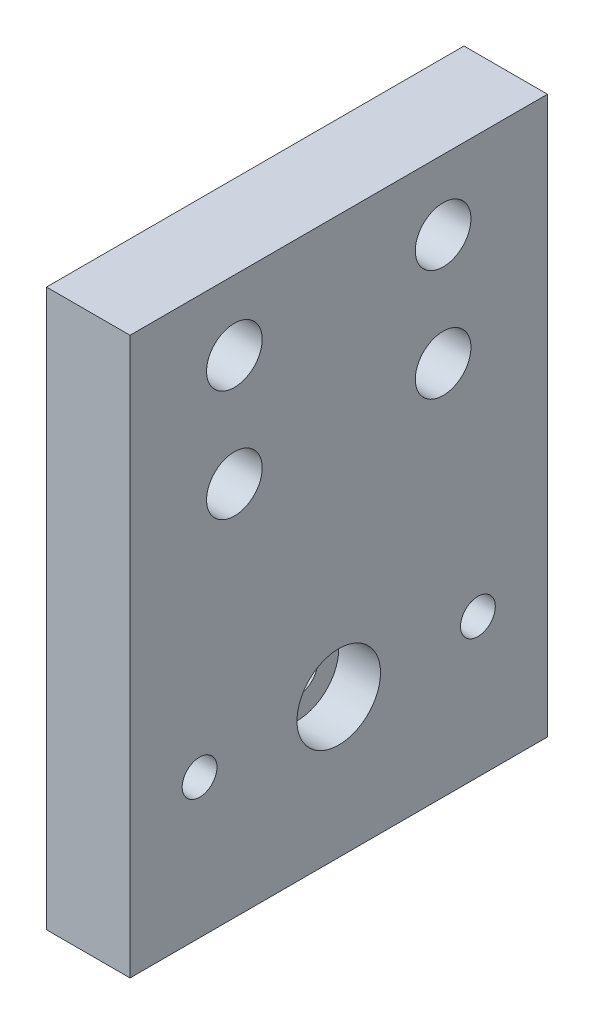
ISO-10303-21;
HEADER;
FILE_DESCRIPTION(('STEP AP214'),'2;1');
FILE_NAME('part.step','',(''),(''),'','','');
FILE_SCHEMA(('AUTOMOTIVE_DESIGN { 1 0 10303 214 1 1 1 1 }'));
ENDSEC;
DATA;
#1=APPLICATION_CONTEXT('core data for automotive mechanical design processes');
#2=APPLICATION_PROTOCOL_DEFINITION('international standard','automotive_design',2000,#1);
#3=PRODUCT_CONTEXT('',#1,'mechanical');
#4=PRODUCT('Part','Part','',(#3));
#5=PRODUCT_RELATED_PRODUCT_CATEGORY('part','',(#4));
#6=PRODUCT_DEFINITION_FORMATION('','',#4);
#7=PRODUCT_DEFINITION_CONTEXT('part definition',#1,'design');
#8=PRODUCT_DEFINITION('design','',#6,#7);
#9=PRODUCT_DEFINITION_SHAPE('','',#8);
#10=(LENGTH_UNIT() NAMED_UNIT(*) SI_UNIT(.MILLI.,.METRE.));
#11=(NAMED_UNIT(*) PLANE_ANGLE_UNIT() SI_UNIT($,.RADIAN.));
#12=(NAMED_UNIT(*) SI_UNIT($,.STERADIAN.) SOLID_ANGLE_UNIT());
#13=UNCERTAINTY_MEASURE_WITH_UNIT(LENGTH_MEASURE(1.E-05),#10,'distance_accuracy_value','');
#14=(GEOMETRIC_REPRESENTATION_CONTEXT(3) GLOBAL_UNCERTAINTY_ASSIGNED_CONTEXT((#13)) GLOBAL_UNIT_ASSIGNED_CONTEXT((#10,
#11,#12)) REPRESENTATION_CONTEXT('',''));
#15=CARTESIAN_POINT('',(0.,0.,0.));
#16=DIRECTION('',(0.,0.,1.));
#17=DIRECTION('',(1.,0.,0.));
#18=AXIS2_PLACEMENT_3D('',#15,#16,#17);
#19=CARTESIAN_POINT('',(0.,50.,25.));
#20=DIRECTION('',(1.,0.,0.));
#21=DIRECTION('',(0.,0.,-1.));
#22=AXIS2_PLACEMENT_3D('',#19,#20,#21);
#23=CYLINDRICAL_SURFACE('',#22,4.50000000000001);
#24=CARTESIAN_POINT('',(0.,50.,25.));
#25=DIRECTION('',(1.,0.,0.));
#26=DIRECTION('',(0.,0.,-1.));
#27=AXIS2_PLACEMENT_3D('',#24,#25,#26);
#28=CIRCLE('',#27,4.50000000000001);
#29=CARTESIAN_POINT('',(0.,50.,20.5));
#30=VERTEX_POINT('',#29);
#31=EDGE_CURVE('E114',#30,#30,#28,.T.);
#32=ORIENTED_EDGE('',*,*,#31,.F.);
#33=EDGE_LOOP('',(#32));
#34=FACE_BOUND('',#33,.T.);
#35=CARTESIAN_POINT('',(21.,50.,25.));
#36=DIRECTION('',(1.,0.,0.));
#37=DIRECTION('',(0.,0.,-1.));
#38=AXIS2_PLACEMENT_3D('',#35,#36,#37);
#39=CIRCLE('',#38,4.50000000000001);
#40=CARTESIAN_POINT('',(21.,50.,20.5));
#41=VERTEX_POINT('',#40);
#42=EDGE_CURVE('E36',#41,#41,#39,.F.);
#43=ORIENTED_EDGE('',*,*,#42,.F.);
#44=EDGE_LOOP('',(#43));
#45=FACE_BOUND('',#44,.T.);
#46=ADVANCED_FACE('F32',(#34,#45),#23,.F.);
#47=CARTESIAN_POINT('',(0.,50.,125.));
#48=DIRECTION('',(1.,0.,0.));
#49=DIRECTION('',(0.,0.,-1.));
#50=AXIS2_PLACEMENT_3D('',#47,#48,#49);
#51=CYLINDRICAL_SURFACE('',#50,4.49999999999999);
#52=CARTESIAN_POINT('',(0.,50.,125.));
#53=DIRECTION('',(1.,0.,0.));
#54=DIRECTION('',(0.,0.,-1.));
#55=AXIS2_PLACEMENT_3D('',#52,#53,#54);
#56=CIRCLE('',#55,4.49999999999999);
#57=CARTESIAN_POINT('',(0.,50.,120.5));
#58=VERTEX_POINT('',#57);
#59=EDGE_CURVE('E119',#58,#58,#56,.T.);
#60=ORIENTED_EDGE('',*,*,#59,.F.);
#61=EDGE_LOOP('',(#60));
#62=FACE_BOUND('',#61,.T.);
#63=CARTESIAN_POINT('',(21.,50.,125.));
#64=DIRECTION('',(1.,0.,0.));
#65=DIRECTION('',(0.,0.,-1.));
#66=AXIS2_PLACEMENT_3D('',#63,#64,#65);
#67=CIRCLE('',#66,4.49999999999999);
#68=CARTESIAN_POINT('',(21.,50.,120.5));
#69=VERTEX_POINT('',#68);
#70=EDGE_CURVE('E112',#69,#69,#67,.F.);
#71=ORIENTED_EDGE('',*,*,#70,.F.);
#72=EDGE_LOOP('',(#71));
#73=FACE_BOUND('',#72,.T.);
#74=ADVANCED_FACE('F185',(#62,#73),#51,.F.);
#75=CARTESIAN_POINT('',(30.,0.,0.));
#76=DIRECTION('',(0.,0.,1.));
#77=DIRECTION('',(1.,0.,0.));
#78=AXIS2_PLACEMENT_3D('',#75,#76,#77);
#79=PLANE('',#78);
#80=DIRECTION('',(0.,1.,0.));
#81=VECTOR('',#80,1.);
#82=CARTESIAN_POINT('',(0.,0.,0.));
#83=LINE('',#82,#81);
#84=CARTESIAN_POINT('',(0.,0.,0.));
#85=VERTEX_POINT('',#84);
#86=CARTESIAN_POINT('',(0.,200.,0.));
#87=VERTEX_POINT('',#86);
#88=EDGE_CURVE('E99',#85,#87,#83,.T.);
#89=ORIENTED_EDGE('',*,*,#88,.T.);
#90=DIRECTION('',(-1.,0.,0.));
#91=VECTOR('',#90,1.);
#92=CARTESIAN_POINT('',(30.,200.,0.));
#93=LINE('',#92,#91);
#94=CARTESIAN_POINT('',(30.,200.,0.));
#95=VERTEX_POINT('',#94);
#96=EDGE_CURVE('E11',#95,#87,#93,.T.);
#97=ORIENTED_EDGE('',*,*,#96,.F.);
#98=DIRECTION('',(0.,1.,0.));
#99=VECTOR('',#98,1.);
#100=CARTESIAN_POINT('',(30.,0.,0.));
#101=LINE('',#100,#99);
#102=CARTESIAN_POINT('',(30.,0.,0.));
#103=VERTEX_POINT('',#102);
#104=EDGE_CURVE('E86',#103,#95,#101,.T.);
#105=ORIENTED_EDGE('',*,*,#104,.F.);
#106=DIRECTION('',(-1.,0.,0.));
#107=VECTOR('',#106,1.);
#108=CARTESIAN_POINT('',(30.,0.,0.));
#109=LINE('',#108,#107);
#110=EDGE_CURVE('E95',#103,#85,#109,.T.);
#111=ORIENTED_EDGE('',*,*,#110,.T.);
#112=EDGE_LOOP('',(#89,#97,#105,#111));
#113=FACE_BOUND('',#112,.T.);
#114=ADVANCED_FACE('F34',(#113),#79,.F.);
#115=CARTESIAN_POINT('',(30.,200.,0.));
#116=DIRECTION('',(0.,-1.,0.));
#117=DIRECTION('',(0.,0.,-1.));
#118=AXIS2_PLACEMENT_3D('',#115,#116,#117);
#119=PLANE('',#118);
#120=DIRECTION('',(0.,0.,1.));
#121=VECTOR('',#120,1.);
#122=CARTESIAN_POINT('',(0.,200.,0.));
#123=LINE('',#122,#121);
#124=CARTESIAN_POINT('',(0.,200.,150.));
#125=VERTEX_POINT('',#124);
#126=EDGE_CURVE('E90',#87,#125,#123,.T.);
#127=ORIENTED_EDGE('',*,*,#126,.T.);
#128=DIRECTION('',(-1.,0.,0.));
#129=VECTOR('',#128,1.);
#130=CARTESIAN_POINT('',(30.,200.,150.));
#131=LINE('',#130,#129);
#132=CARTESIAN_POINT('',(30.,200.,150.));
#133=VERTEX_POINT('',#132);
#134=EDGE_CURVE('E42',#133,#125,#131,.T.);
#135=ORIENTED_EDGE('',*,*,#134,.F.);
#136=DIRECTION('',(0.,0.,1.));
#137=VECTOR('',#136,1.);
#138=CARTESIAN_POINT('',(30.,200.,0.));
#139=LINE('',#138,#137);
#140=EDGE_CURVE('E81',#95,#133,#139,.T.);
#141=ORIENTED_EDGE('',*,*,#140,.F.);
#142=ORIENTED_EDGE('',*,*,#96,.T.);
#143=EDGE_LOOP('',(#127,#135,#141,#142));
#144=FACE_BOUND('',#143,.T.);
#145=ADVANCED_FACE('F89',(#144),#119,.F.);
#146=CARTESIAN_POINT('',(30.,0.,150.));
#147=DIRECTION('',(0.,0.,-1.));
#148=DIRECTION('',(-1.,0.,0.));
#149=AXIS2_PLACEMENT_3D('',#146,#147,#148);
#150=PLANE('',#149);
#151=DIRECTION('',(0.,-1.,0.));
#152=VECTOR('',#151,1.);
#153=CARTESIAN_POINT('',(0.,0.,150.));
#154=LINE('',#153,#152);
#155=CARTESIAN_POINT('',(0.,0.,150.));
#156=VERTEX_POINT('',#155);
#157=EDGE_CURVE('E68',#125,#156,#154,.T.);
#158=ORIENTED_EDGE('',*,*,#157,.T.);
#159=DIRECTION('',(-1.,0.,0.));
#160=VECTOR('',#159,1.);
#161=CARTESIAN_POINT('',(30.,0.,150.));
#162=LINE('',#161,#160);
#163=CARTESIAN_POINT('',(30.,0.,150.));
#164=VERTEX_POINT('',#163);
#165=EDGE_CURVE('E91',#164,#156,#162,.T.);
#166=ORIENTED_EDGE('',*,*,#165,.F.);
#167=DIRECTION('',(0.,-1.,0.));
#168=VECTOR('',#167,1.);
#169=CARTESIAN_POINT('',(30.,0.,150.));
#170=LINE('',#169,#168);
#171=EDGE_CURVE('E84',#133,#164,#170,.T.);
#172=ORIENTED_EDGE('',*,*,#171,.F.);
#173=ORIENTED_EDGE('',*,*,#134,.T.);
#174=EDGE_LOOP('',(#158,#166,#172,#173));
#175=FACE_BOUND('',#174,.T.);
#176=ADVANCED_FACE('F93',(#175),#150,.F.);
#177=CARTESIAN_POINT('',(30.,0.,0.));
#178=DIRECTION('',(0.,1.,0.));
#179=DIRECTION('',(0.,0.,1.));
#180=AXIS2_PLACEMENT_3D('',#177,#178,#179);
#181=PLANE('',#180);
#182=DIRECTION('',(0.,0.,-1.));
#183=VECTOR('',#182,1.);
#184=CARTESIAN_POINT('',(0.,0.,0.));
#185=LINE('',#184,#183);
#186=EDGE_CURVE('E74',#156,#85,#185,.T.);
#187=ORIENTED_EDGE('',*,*,#186,.T.);
#188=ORIENTED_EDGE('',*,*,#110,.F.);
#189=DIRECTION('',(0.,0.,-1.));
#190=VECTOR('',#189,1.);
#191=CARTESIAN_POINT('',(30.,0.,0.));
#192=LINE('',#191,#190);
#193=EDGE_CURVE('E51',#164,#103,#192,.T.);
#194=ORIENTED_EDGE('',*,*,#193,.F.);
#195=ORIENTED_EDGE('',*,*,#165,.T.);
#196=EDGE_LOOP('',(#187,#188,#194,#195));
#197=FACE_BOUND('',#196,.T.);
#198=ADVANCED_FACE('F169',(#197),#181,.F.);
#199=CARTESIAN_POINT('',(30.,0.,0.));
#200=DIRECTION('',(1.,0.,0.));
#201=DIRECTION('',(0.,0.,-1.));
#202=AXIS2_PLACEMENT_3D('',#199,#200,#201);
#203=PLANE('',#202);
#204=CARTESIAN_POINT('',(30.,50.,25.));
#205=DIRECTION('',(1.,0.,0.));
#206=DIRECTION('',(0.,0.,-1.));
#207=AXIS2_PLACEMENT_3D('',#204,#205,#206);
#208=CIRCLE('',#207,6.25);
#209=CARTESIAN_POINT('',(30.,50.,18.75));
#210=VERTEX_POINT('',#209);
#211=EDGE_CURVE('E129',#210,#210,#208,.T.);
#212=ORIENTED_EDGE('',*,*,#211,.F.);
#213=EDGE_LOOP('',(#212));
#214=FACE_BOUND('',#213,.T.);
#215=CARTESIAN_POINT('',(30.,50.,125.));
#216=DIRECTION('',(1.,0.,0.));
#217=DIRECTION('',(0.,0.,-1.));
#218=AXIS2_PLACEMENT_3D('',#215,#216,#217);
#219=CIRCLE('',#218,6.25);
#220=CARTESIAN_POINT('',(30.,50.,118.75));
#221=VERTEX_POINT('',#220);
#222=EDGE_CURVE('E122',#221,#221,#219,.T.);
#223=ORIENTED_EDGE('',*,*,#222,.F.);
#224=EDGE_LOOP('',(#223));
#225=FACE_BOUND('',#224,.T.);
#226=CARTESIAN_POINT('',(30.,50.,75.));
#227=DIRECTION('',(1.,0.,0.));
#228=DIRECTION('',(0.,0.,-1.));
#229=AXIS2_PLACEMENT_3D('',#226,#227,#228);
#230=CIRCLE('',#229,15.);
#231=CARTESIAN_POINT('',(30.,50.,60.));
#232=VERTEX_POINT('',#231);
#233=EDGE_CURVE('E110',#232,#232,#230,.T.);
#234=ORIENTED_EDGE('',*,*,#233,.F.);
#235=EDGE_LOOP('',(#234));
#236=FACE_BOUND('',#235,.T.);
#237=CARTESIAN_POINT('',(30.,175.,37.5000000000001));
#238=DIRECTION('',(1.,0.,0.));
#239=DIRECTION('',(0.,0.,1.));
#240=AXIS2_PLACEMENT_3D('',#237,#238,#239);
#241=CIRCLE('',#240,10.);
#242=CARTESIAN_POINT('',(30.,175.,47.5000000000001));
#243=VERTEX_POINT('',#242);
#244=EDGE_CURVE('E146',#243,#243,#241,.T.);
#245=ORIENTED_EDGE('',*,*,#244,.F.);
#246=EDGE_LOOP('',(#245));
#247=FACE_BOUND('',#246,.T.);
#248=CARTESIAN_POINT('',(30.,135.,112.5));
#249=DIRECTION('',(1.,0.,0.));
#250=DIRECTION('',(0.,0.,-1.));
#251=AXIS2_PLACEMENT_3D('',#248,#249,#250);
#252=CIRCLE('',#251,10.);
#253=CARTESIAN_POINT('',(30.,135.,102.5));
#254=VERTEX_POINT('',#253);
#255=EDGE_CURVE('E152',#254,#254,#252,.T.);
#256=ORIENTED_EDGE('',*,*,#255,.F.);
#257=EDGE_LOOP('',(#256));
#258=FACE_BOUND('',#257,.T.);
#259=CARTESIAN_POINT('',(30.,135.,37.5));
#260=DIRECTION('',(1.,0.,0.));
#261=DIRECTION('',(0.,0.,1.));
#262=AXIS2_PLACEMENT_3D('',#259,#260,#261);
#263=CIRCLE('',#262,10.);
#264=CARTESIAN_POINT('',(30.,135.,47.5));
#265=VERTEX_POINT('',#264);
#266=EDGE_CURVE('E139',#265,#265,#263,.T.);
#267=ORIENTED_EDGE('',*,*,#266,.F.);
#268=EDGE_LOOP('',(#267));
#269=FACE_BOUND('',#268,.T.);
#270=CARTESIAN_POINT('',(30.,175.,112.5));
#271=DIRECTION('',(1.,0.,0.));
#272=DIRECTION('',(0.,0.,-1.));
#273=AXIS2_PLACEMENT_3D('',#270,#271,#272);
#274=CIRCLE('',#273,10.);
#275=CARTESIAN_POINT('',(30.,175.,102.5));
#276=VERTEX_POINT('',#275);
#277=EDGE_CURVE('E145',#276,#276,#274,.T.);
#278=ORIENTED_EDGE('',*,*,#277,.F.);
#279=EDGE_LOOP('',(#278));
#280=FACE_BOUND('',#279,.T.);
#281=ORIENTED_EDGE('',*,*,#104,.T.);
#282=ORIENTED_EDGE('',*,*,#140,.T.);
#283=ORIENTED_EDGE('',*,*,#171,.T.);
#284=ORIENTED_EDGE('',*,*,#193,.T.);
#285=EDGE_LOOP('',(#281,#282,#283,#284));
#286=FACE_BOUND('',#285,.T.);
#287=ADVANCED_FACE('F82',(#214,#225,#236,#247,#258,#269,#280,#286),#203,.T.);
#288=CARTESIAN_POINT('',(0.,0.,0.));
#289=DIRECTION('',(1.,0.,0.));
#290=DIRECTION('',(0.,0.,-1.));
#291=AXIS2_PLACEMENT_3D('',#288,#289,#290);
#292=PLANE('',#291);
#293=ORIENTED_EDGE('',*,*,#31,.T.);
#294=EDGE_LOOP('',(#293));
#295=FACE_BOUND('',#294,.T.);
#296=ORIENTED_EDGE('',*,*,#59,.T.);
#297=EDGE_LOOP('',(#296));
#298=FACE_BOUND('',#297,.T.);
#299=CARTESIAN_POINT('',(0.,50.,75.));
#300=DIRECTION('',(1.,0.,0.));
#301=DIRECTION('',(0.,0.,-1.));
#302=AXIS2_PLACEMENT_3D('',#299,#300,#301);
#303=CIRCLE('',#302,7.5);
#304=CARTESIAN_POINT('',(0.,50.,67.5));
#305=VERTEX_POINT('',#304);
#306=EDGE_CURVE('E111',#305,#305,#303,.T.);
#307=ORIENTED_EDGE('',*,*,#306,.T.);
#308=EDGE_LOOP('',(#307));
#309=FACE_BOUND('',#308,.T.);
#310=CARTESIAN_POINT('',(0.,175.,37.5000000000001));
#311=DIRECTION('',(1.,0.,0.));
#312=DIRECTION('',(0.,0.,1.));
#313=AXIS2_PLACEMENT_3D('',#310,#311,#312);
#314=CIRCLE('',#313,10.);
#315=CARTESIAN_POINT('',(0.,175.,47.5000000000001));
#316=VERTEX_POINT('',#315);
#317=EDGE_CURVE('E142',#316,#316,#314,.T.);
#318=ORIENTED_EDGE('',*,*,#317,.T.);
#319=EDGE_LOOP('',(#318));
#320=FACE_BOUND('',#319,.T.);
#321=CARTESIAN_POINT('',(0.,135.,112.5));
#322=DIRECTION('',(1.,0.,0.));
#323=DIRECTION('',(0.,0.,-1.));
#324=AXIS2_PLACEMENT_3D('',#321,#322,#323);
#325=CIRCLE('',#324,10.);
#326=CARTESIAN_POINT('',(0.,135.,102.5));
#327=VERTEX_POINT('',#326);
#328=EDGE_CURVE('E149',#327,#327,#325,.T.);
#329=ORIENTED_EDGE('',*,*,#328,.T.);
#330=EDGE_LOOP('',(#329));
#331=FACE_BOUND('',#330,.T.);
#332=CARTESIAN_POINT('',(0.,135.,37.5));
#333=DIRECTION('',(1.,0.,0.));
#334=DIRECTION('',(0.,0.,1.));
#335=AXIS2_PLACEMENT_3D('',#332,#333,#334);
#336=CIRCLE('',#335,10.);
#337=CARTESIAN_POINT('',(0.,135.,47.5));
#338=VERTEX_POINT('',#337);
#339=EDGE_CURVE('E155',#338,#338,#336,.T.);
#340=ORIENTED_EDGE('',*,*,#339,.T.);
#341=EDGE_LOOP('',(#340));
#342=FACE_BOUND('',#341,.T.);
#343=CARTESIAN_POINT('',(0.,175.,112.5));
#344=DIRECTION('',(1.,0.,0.));
#345=DIRECTION('',(0.,0.,-1.));
#346=AXIS2_PLACEMENT_3D('',#343,#344,#345);
#347=CIRCLE('',#346,10.);
#348=CARTESIAN_POINT('',(0.,175.,102.5));
#349=VERTEX_POINT('',#348);
#350=EDGE_CURVE('E102',#349,#349,#347,.T.);
#351=ORIENTED_EDGE('',*,*,#350,.T.);
#352=EDGE_LOOP('',(#351));
#353=FACE_BOUND('',#352,.T.);
#354=ORIENTED_EDGE('',*,*,#88,.F.);
#355=ORIENTED_EDGE('',*,*,#186,.F.);
#356=ORIENTED_EDGE('',*,*,#157,.F.);
#357=ORIENTED_EDGE('',*,*,#126,.F.);
#358=EDGE_LOOP('',(#354,#355,#356,#357));
#359=FACE_BOUND('',#358,.T.);
#360=ADVANCED_FACE('F168',(#295,#298,#309,#320,#331,#342,#353,#359),#292,.F.);
#361=CARTESIAN_POINT('',(0.,175.,112.5));
#362=DIRECTION('',(1.,0.,0.));
#363=DIRECTION('',(0.,0.,-1.));
#364=AXIS2_PLACEMENT_3D('',#361,#362,#363);
#365=CYLINDRICAL_SURFACE('',#364,10.);
#366=ORIENTED_EDGE('',*,*,#350,.F.);
#367=EDGE_LOOP('',(#366));
#368=FACE_BOUND('',#367,.T.);
#369=ORIENTED_EDGE('',*,*,#277,.T.);
#370=EDGE_LOOP('',(#369));
#371=FACE_BOUND('',#370,.T.);
#372=ADVANCED_FACE('F165',(#368,#371),#365,.F.);
#373=CARTESIAN_POINT('',(0.,135.,37.5));
#374=DIRECTION('',(1.,0.,0.));
#375=DIRECTION('',(0.,0.,-1.));
#376=AXIS2_PLACEMENT_3D('',#373,#374,#375);
#377=CYLINDRICAL_SURFACE('',#376,10.);
#378=ORIENTED_EDGE('',*,*,#339,.F.);
#379=EDGE_LOOP('',(#378));
#380=FACE_BOUND('',#379,.T.);
#381=ORIENTED_EDGE('',*,*,#266,.T.);
#382=EDGE_LOOP('',(#381));
#383=FACE_BOUND('',#382,.T.);
#384=ADVANCED_FACE('F219',(#380,#383),#377,.F.);
#385=CARTESIAN_POINT('',(0.,135.,112.5));
#386=DIRECTION('',(1.,0.,0.));
#387=DIRECTION('',(0.,0.,-1.));
#388=AXIS2_PLACEMENT_3D('',#385,#386,#387);
#389=CYLINDRICAL_SURFACE('',#388,10.);
#390=ORIENTED_EDGE('',*,*,#328,.F.);
#391=EDGE_LOOP('',(#390));
#392=FACE_BOUND('',#391,.T.);
#393=ORIENTED_EDGE('',*,*,#255,.T.);
#394=EDGE_LOOP('',(#393));
#395=FACE_BOUND('',#394,.T.);
#396=ADVANCED_FACE('F215',(#392,#395),#389,.F.);
#397=CARTESIAN_POINT('',(0.,175.,37.5000000000001));
#398=DIRECTION('',(1.,0.,0.));
#399=DIRECTION('',(0.,0.,-1.));
#400=AXIS2_PLACEMENT_3D('',#397,#398,#399);
#401=CYLINDRICAL_SURFACE('',#400,10.);
#402=ORIENTED_EDGE('',*,*,#317,.F.);
#403=EDGE_LOOP('',(#402));
#404=FACE_BOUND('',#403,.T.);
#405=ORIENTED_EDGE('',*,*,#244,.T.);
#406=EDGE_LOOP('',(#405));
#407=FACE_BOUND('',#406,.T.);
#408=ADVANCED_FACE('F211',(#404,#407),#401,.F.);
#409=CARTESIAN_POINT('',(15.,50.,75.));
#410=DIRECTION('',(1.,0.,0.));
#411=DIRECTION('',(0.,0.,-1.));
#412=AXIS2_PLACEMENT_3D('',#409,#410,#411);
#413=CYLINDRICAL_SURFACE('',#412,15.);
#414=CARTESIAN_POINT('',(15.,50.,75.));
#415=DIRECTION('',(1.,0.,0.));
#416=DIRECTION('',(0.,0.,-1.));
#417=AXIS2_PLACEMENT_3D('',#414,#415,#416);
#418=CIRCLE('',#417,15.);
#419=CARTESIAN_POINT('',(15.,50.,60.));
#420=VERTEX_POINT('',#419);
#421=EDGE_CURVE('E136',#420,#420,#418,.T.);
#422=ORIENTED_EDGE('',*,*,#421,.F.);
#423=EDGE_LOOP('',(#422));
#424=FACE_BOUND('',#423,.T.);
#425=ORIENTED_EDGE('',*,*,#233,.T.);
#426=EDGE_LOOP('',(#425));
#427=FACE_BOUND('',#426,.T.);
#428=ADVANCED_FACE('F207',(#424,#427),#413,.F.);
#429=CARTESIAN_POINT('',(15.,50.,75.));
#430=DIRECTION('',(1.,0.,0.));
#431=DIRECTION('',(0.,0.,-1.));
#432=AXIS2_PLACEMENT_3D('',#429,#430,#431);
#433=PLANE('',#432);
#434=CARTESIAN_POINT('',(15.,50.,75.));
#435=DIRECTION('',(1.,0.,0.));
#436=DIRECTION('',(0.,0.,-1.));
#437=AXIS2_PLACEMENT_3D('',#434,#435,#436);
#438=CIRCLE('',#437,7.5);
#439=CARTESIAN_POINT('',(15.,50.,67.5));
#440=VERTEX_POINT('',#439);
#441=EDGE_CURVE('E108',#440,#440,#438,.T.);
#442=ORIENTED_EDGE('',*,*,#441,.F.);
#443=EDGE_LOOP('',(#442));
#444=FACE_BOUND('',#443,.T.);
#445=ORIENTED_EDGE('',*,*,#421,.T.);
#446=EDGE_LOOP('',(#445));
#447=FACE_BOUND('',#446,.T.);
#448=ADVANCED_FACE('F203',(#444,#447),#433,.T.);
#449=CARTESIAN_POINT('',(0.,50.,75.));
#450=DIRECTION('',(1.,0.,0.));
#451=DIRECTION('',(0.,0.,-1.));
#452=AXIS2_PLACEMENT_3D('',#449,#450,#451);
#453=CYLINDRICAL_SURFACE('',#452,7.5);
#454=ORIENTED_EDGE('',*,*,#441,.T.);
#455=EDGE_LOOP('',(#454));
#456=FACE_BOUND('',#455,.T.);
#457=ORIENTED_EDGE('',*,*,#306,.F.);
#458=EDGE_LOOP('',(#457));
#459=FACE_BOUND('',#458,.T.);
#460=ADVANCED_FACE('F200',(#456,#459),#453,.F.);
#461=CARTESIAN_POINT('',(21.,50.,125.));
#462=DIRECTION('',(1.,0.,0.));
#463=DIRECTION('',(0.,0.,-1.));
#464=AXIS2_PLACEMENT_3D('',#461,#462,#463);
#465=PLANE('',#464);
#466=CARTESIAN_POINT('',(21.,50.,125.));
#467=DIRECTION('',(1.,0.,0.));
#468=DIRECTION('',(0.,0.,-1.));
#469=AXIS2_PLACEMENT_3D('',#466,#467,#468);
#470=CIRCLE('',#469,6.25);
#471=CARTESIAN_POINT('',(21.,50.,118.75));
#472=VERTEX_POINT('',#471);
#473=EDGE_CURVE('E115',#472,#472,#470,.T.);
#474=ORIENTED_EDGE('',*,*,#473,.T.);
#475=EDGE_LOOP('',(#474));
#476=FACE_BOUND('',#475,.T.);
#477=ORIENTED_EDGE('',*,*,#70,.T.);
#478=EDGE_LOOP('',(#477));
#479=FACE_BOUND('',#478,.T.);
#480=ADVANCED_FACE('F202',(#476,#479),#465,.T.);
#481=CARTESIAN_POINT('',(21.,50.,125.));
#482=DIRECTION('',(1.,0.,0.));
#483=DIRECTION('',(0.,0.,-1.));
#484=AXIS2_PLACEMENT_3D('',#481,#482,#483);
#485=CYLINDRICAL_SURFACE('',#484,6.25);
#486=ORIENTED_EDGE('',*,*,#473,.F.);
#487=EDGE_LOOP('',(#486));
#488=FACE_BOUND('',#487,.T.);
#489=ORIENTED_EDGE('',*,*,#222,.T.);
#490=EDGE_LOOP('',(#489));
#491=FACE_BOUND('',#490,.T.);
#492=ADVANCED_FACE('F197',(#488,#491),#485,.F.);
#493=CARTESIAN_POINT('',(21.,50.,25.));
#494=DIRECTION('',(1.,0.,0.));
#495=DIRECTION('',(0.,0.,-1.));
#496=AXIS2_PLACEMENT_3D('',#493,#494,#495);
#497=PLANE('',#496);
#498=CARTESIAN_POINT('',(21.,50.,25.));
#499=DIRECTION('',(1.,0.,0.));
#500=DIRECTION('',(0.,0.,-1.));
#501=AXIS2_PLACEMENT_3D('',#498,#499,#500);
#502=CIRCLE('',#501,6.25);
#503=CARTESIAN_POINT('',(21.,50.,18.75));
#504=VERTEX_POINT('',#503);
#505=EDGE_CURVE('E309',#504,#504,#502,.T.);
#506=ORIENTED_EDGE('',*,*,#505,.T.);
#507=EDGE_LOOP('',(#506));
#508=FACE_BOUND('',#507,.T.);
#509=ORIENTED_EDGE('',*,*,#42,.T.);
#510=EDGE_LOOP('',(#509));
#511=FACE_BOUND('',#510,.T.);
#512=ADVANCED_FACE('F280',(#508,#511),#497,.T.);
#513=CARTESIAN_POINT('',(21.,50.,25.));
#514=DIRECTION('',(1.,0.,0.));
#515=DIRECTION('',(0.,0.,-1.));
#516=AXIS2_PLACEMENT_3D('',#513,#514,#515);
#517=CYLINDRICAL_SURFACE('',#516,6.25);
#518=ORIENTED_EDGE('',*,*,#505,.F.);
#519=EDGE_LOOP('',(#518));
#520=FACE_BOUND('',#519,.T.);
#521=ORIENTED_EDGE('',*,*,#211,.T.);
#522=EDGE_LOOP('',(#521));
#523=FACE_BOUND('',#522,.T.);
#524=ADVANCED_FACE('F287',(#520,#523),#517,.F.);
#525=CLOSED_SHELL('',(#46,#74,#114,#145,#176,#198,#287,#360,#372,#384,#396,#408,#428,#448,#460,
#480,#492,#512,#524));
#526=MANIFOLD_SOLID_BREP('B2',#525);
#527=ADVANCED_BREP_SHAPE_REPRESENTATION('',(#18,#526),#14);
#528=SHAPE_DEFINITION_REPRESENTATION(#9,#527);
ENDSEC;
END-ISO-10303-21;
